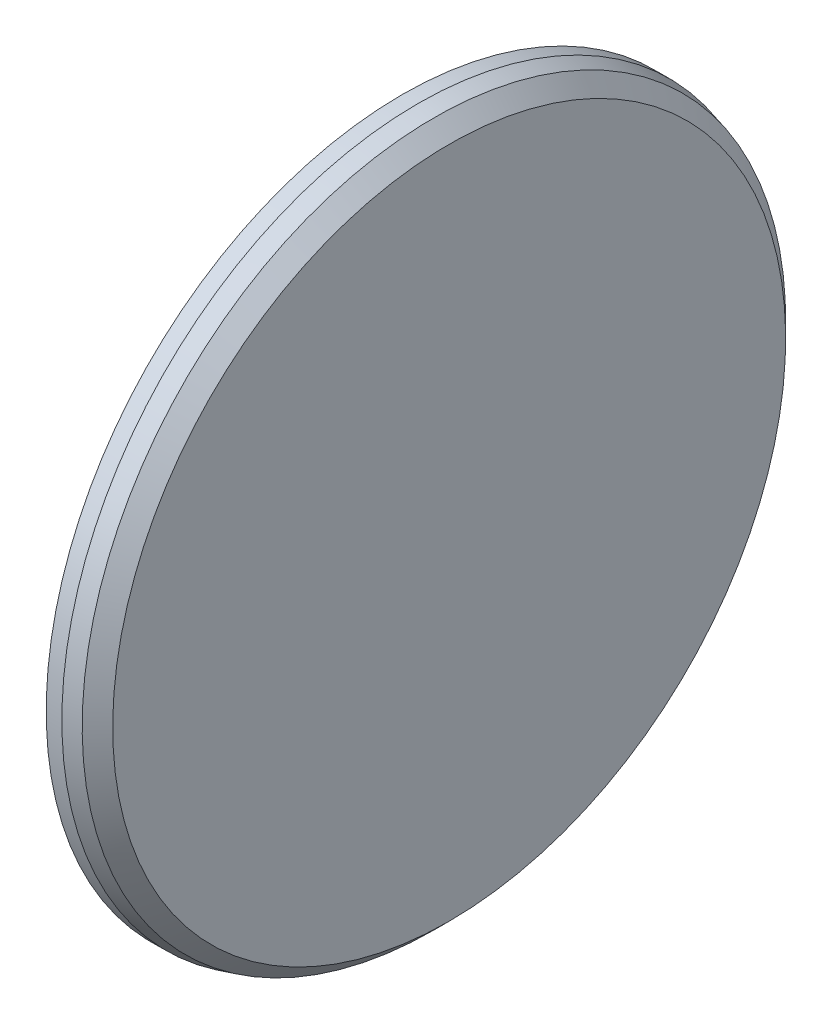
ISO-10303-21;
HEADER;
FILE_DESCRIPTION(('STEP AP214'),'2;1');
FILE_NAME('part.step','',(''),(''),'','','');
FILE_SCHEMA(('AUTOMOTIVE_DESIGN { 1 0 10303 214 1 1 1 1 }'));
ENDSEC;
DATA;
#1=APPLICATION_CONTEXT('core data for automotive mechanical design processes');
#2=APPLICATION_PROTOCOL_DEFINITION('international standard','automotive_design',2000,#1);
#3=PRODUCT_CONTEXT('',#1,'mechanical');
#4=PRODUCT('Part','Part','',(#3));
#5=PRODUCT_RELATED_PRODUCT_CATEGORY('part','',(#4));
#6=PRODUCT_DEFINITION_FORMATION('','',#4);
#7=PRODUCT_DEFINITION_CONTEXT('part definition',#1,'design');
#8=PRODUCT_DEFINITION('design','',#6,#7);
#9=PRODUCT_DEFINITION_SHAPE('','',#8);
#10=(LENGTH_UNIT() NAMED_UNIT(*) SI_UNIT(.MILLI.,.METRE.));
#11=(NAMED_UNIT(*) PLANE_ANGLE_UNIT() SI_UNIT($,.RADIAN.));
#12=(NAMED_UNIT(*) SI_UNIT($,.STERADIAN.) SOLID_ANGLE_UNIT());
#13=UNCERTAINTY_MEASURE_WITH_UNIT(LENGTH_MEASURE(1.E-05),#10,'distance_accuracy_value','');
#14=(GEOMETRIC_REPRESENTATION_CONTEXT(3) GLOBAL_UNCERTAINTY_ASSIGNED_CONTEXT((#13)) GLOBAL_UNIT_ASSIGNED_CONTEXT((#10,
#11,#12)) REPRESENTATION_CONTEXT('',''));
#15=CARTESIAN_POINT('',(0.,0.,0.));
#16=DIRECTION('',(0.,0.,1.));
#17=DIRECTION('',(1.,0.,0.));
#18=AXIS2_PLACEMENT_3D('',#15,#16,#17);
#19=CARTESIAN_POINT('',(40.,0.,0.));
#20=DIRECTION('',(-1.,0.,0.));
#21=DIRECTION('',(0.,-1.,0.));
#22=AXIS2_PLACEMENT_3D('',#19,#20,#21);
#23=PLANE('',#22);
#24=CARTESIAN_POINT('',(40.,0.,0.));
#25=DIRECTION('',(-1.,0.,0.));
#26=DIRECTION('',(0.,-1.,0.));
#27=AXIS2_PLACEMENT_3D('',#24,#25,#26);
#28=CIRCLE('',#27,430.);
#29=CARTESIAN_POINT('',(40.0000000000001,-430.,0.));
#30=VERTEX_POINT('',#29);
#31=EDGE_CURVE('E10',#30,#30,#28,.T.);
#32=ORIENTED_EDGE('',*,*,#31,.F.);
#33=EDGE_LOOP('',(#32));
#34=FACE_BOUND('',#33,.T.);
#35=ADVANCED_FACE('F43',(#34),#23,.F.);
#36=CARTESIAN_POINT('',(20.490381056767,0.,0.));
#37=DIRECTION('',(-1.,0.,0.));
#38=DIRECTION('',(0.,-1.,0.));
#39=AXIS2_PLACEMENT_3D('',#36,#37,#38);
#40=CONICAL_SURFACE('',#39,449.509618943233,0.785398163397454);
#41=ORIENTED_EDGE('',*,*,#31,.T.);
#42=EDGE_LOOP('',(#41));
#43=FACE_BOUND('',#42,.T.);
#44=CARTESIAN_POINT('',(20.490381056767,0.,0.));
#45=DIRECTION('',(-1.,0.,0.));
#46=DIRECTION('',(0.,-1.,0.));
#47=AXIS2_PLACEMENT_3D('',#44,#45,#46);
#48=CIRCLE('',#47,449.509618943233);
#49=CARTESIAN_POINT('',(20.490381056767,-449.509618943233,0.));
#50=VERTEX_POINT('',#49);
#51=EDGE_CURVE('E49',#50,#50,#48,.T.);
#52=ORIENTED_EDGE('',*,*,#51,.F.);
#53=EDGE_LOOP('',(#52));
#54=FACE_BOUND('',#53,.T.);
#55=ADVANCED_FACE('F91',(#43,#54),#40,.T.);
#56=CARTESIAN_POINT('',(0.,0.,0.));
#57=DIRECTION('',(-1.,0.,0.));
#58=DIRECTION('',(0.,-1.,0.));
#59=AXIS2_PLACEMENT_3D('',#56,#57,#58);
#60=CONICAL_SURFACE('',#59,455.,0.261799387799151);
#61=ORIENTED_EDGE('',*,*,#51,.T.);
#62=EDGE_LOOP('',(#61));
#63=FACE_BOUND('',#62,.T.);
#64=CARTESIAN_POINT('',(0.,0.,0.));
#65=DIRECTION('',(-1.,0.,0.));
#66=DIRECTION('',(0.,-1.,0.));
#67=AXIS2_PLACEMENT_3D('',#64,#65,#66);
#68=CIRCLE('',#67,455.);
#69=CARTESIAN_POINT('',(1.66848870888694E-13,-455.,0.));
#70=VERTEX_POINT('',#69);
#71=EDGE_CURVE('E53',#70,#70,#68,.T.);
#72=ORIENTED_EDGE('',*,*,#71,.F.);
#73=EDGE_LOOP('',(#72));
#74=FACE_BOUND('',#73,.T.);
#75=ADVANCED_FACE('F96',(#63,#74),#60,.T.);
#76=CARTESIAN_POINT('',(-40.,0.,0.));
#77=DIRECTION('',(-1.,0.,0.));
#78=DIRECTION('',(0.,-1.,0.));
#79=AXIS2_PLACEMENT_3D('',#76,#77,#78);
#80=CYLINDRICAL_SURFACE('',#79,455.);
#81=ORIENTED_EDGE('',*,*,#71,.T.);
#82=EDGE_LOOP('',(#81));
#83=FACE_BOUND('',#82,.T.);
#84=CARTESIAN_POINT('',(-19.9999999999999,0.,0.));
#85=DIRECTION('',(-1.,0.,0.));
#86=DIRECTION('',(0.,-1.,0.));
#87=AXIS2_PLACEMENT_3D('',#84,#85,#86);
#88=CIRCLE('',#87,455.);
#89=CARTESIAN_POINT('',(-19.9999999999998,-455.,0.));
#90=VERTEX_POINT('',#89);
#91=EDGE_CURVE('E57',#90,#90,#88,.T.);
#92=ORIENTED_EDGE('',*,*,#91,.F.);
#93=EDGE_LOOP('',(#92));
#94=FACE_BOUND('',#93,.T.);
#95=ADVANCED_FACE('F100',(#83,#94),#80,.T.);
#96=CARTESIAN_POINT('',(-19.9999999999999,0.,0.));
#97=DIRECTION('',(1.,0.,0.));
#98=DIRECTION('',(0.,1.,0.));
#99=AXIS2_PLACEMENT_3D('',#96,#97,#98);
#100=PLANE('',#99);
#101=CARTESIAN_POINT('',(-19.9999999999999,0.,0.));
#102=DIRECTION('',(-1.,0.,0.));
#103=DIRECTION('',(0.,-1.,0.));
#104=AXIS2_PLACEMENT_3D('',#101,#102,#103);
#105=CIRCLE('',#104,410.);
#106=CARTESIAN_POINT('',(-19.9999999999998,-410.,0.));
#107=VERTEX_POINT('',#106);
#108=EDGE_CURVE('E62',#107,#107,#105,.T.);
#109=ORIENTED_EDGE('',*,*,#108,.F.);
#110=EDGE_LOOP('',(#109));
#111=FACE_BOUND('',#110,.T.);
#112=ORIENTED_EDGE('',*,*,#91,.T.);
#113=EDGE_LOOP('',(#112));
#114=FACE_BOUND('',#113,.T.);
#115=ADVANCED_FACE('F106',(#111,#114),#100,.F.);
#116=CARTESIAN_POINT('',(-40.,0.,0.));
#117=DIRECTION('',(-1.,0.,0.));
#118=DIRECTION('',(0.,-1.,0.));
#119=AXIS2_PLACEMENT_3D('',#116,#117,#118);
#120=CYLINDRICAL_SURFACE('',#119,410.);
#121=ORIENTED_EDGE('',*,*,#108,.T.);
#122=EDGE_LOOP('',(#121));
#123=FACE_BOUND('',#122,.T.);
#124=CARTESIAN_POINT('',(10.0000000000001,0.,0.));
#125=DIRECTION('',(-1.,0.,0.));
#126=DIRECTION('',(0.,-1.,0.));
#127=AXIS2_PLACEMENT_3D('',#124,#125,#126);
#128=CIRCLE('',#127,410.);
#129=CARTESIAN_POINT('',(10.0000000000002,-410.,0.));
#130=VERTEX_POINT('',#129);
#131=EDGE_CURVE('E65',#130,#130,#128,.T.);
#132=ORIENTED_EDGE('',*,*,#131,.F.);
#133=EDGE_LOOP('',(#132));
#134=FACE_BOUND('',#133,.T.);
#135=ADVANCED_FACE('F87',(#123,#134),#120,.F.);
#136=CARTESIAN_POINT('',(10.,0.,0.));
#137=DIRECTION('',(-1.,0.,0.));
#138=DIRECTION('',(0.,-1.,0.));
#139=AXIS2_PLACEMENT_3D('',#136,#137,#138);
#140=PLANE('',#139);
#141=ORIENTED_EDGE('',*,*,#131,.T.);
#142=EDGE_LOOP('',(#141));
#143=FACE_BOUND('',#142,.T.);
#144=CARTESIAN_POINT('',(10.,0.,0.));
#145=DIRECTION('',(-1.,0.,0.));
#146=DIRECTION('',(0.,-1.,0.));
#147=AXIS2_PLACEMENT_3D('',#144,#145,#146);
#148=CIRCLE('',#147,100.);
#149=CARTESIAN_POINT('',(10.,-100.,0.));
#150=VERTEX_POINT('',#149);
#151=EDGE_CURVE('E68',#150,#150,#148,.T.);
#152=ORIENTED_EDGE('',*,*,#151,.F.);
#153=EDGE_LOOP('',(#152));
#154=FACE_BOUND('',#153,.T.);
#155=ADVANCED_FACE('F79',(#143,#154),#140,.T.);
#156=CARTESIAN_POINT('',(-40.,0.,0.));
#157=DIRECTION('',(-1.,0.,0.));
#158=DIRECTION('',(0.,-1.,0.));
#159=AXIS2_PLACEMENT_3D('',#156,#157,#158);
#160=CYLINDRICAL_SURFACE('',#159,100.);
#161=ORIENTED_EDGE('',*,*,#151,.T.);
#162=EDGE_LOOP('',(#161));
#163=FACE_BOUND('',#162,.T.);
#164=CARTESIAN_POINT('',(-40.,0.,0.));
#165=DIRECTION('',(-1.,0.,0.));
#166=DIRECTION('',(0.,-1.,0.));
#167=AXIS2_PLACEMENT_3D('',#164,#165,#166);
#168=CIRCLE('',#167,100.);
#169=CARTESIAN_POINT('',(-40.,-100.,0.));
#170=VERTEX_POINT('',#169);
#171=EDGE_CURVE('E71',#170,#170,#168,.T.);
#172=ORIENTED_EDGE('',*,*,#171,.F.);
#173=EDGE_LOOP('',(#172));
#174=FACE_BOUND('',#173,.T.);
#175=ADVANCED_FACE('F77',(#163,#174),#160,.T.);
#176=CARTESIAN_POINT('',(-40.,0.,0.));
#177=DIRECTION('',(-1.,0.,0.));
#178=DIRECTION('',(0.,-1.,0.));
#179=AXIS2_PLACEMENT_3D('',#176,#177,#178);
#180=PLANE('',#179);
#181=ORIENTED_EDGE('',*,*,#171,.T.);
#182=EDGE_LOOP('',(#181));
#183=FACE_BOUND('',#182,.T.);
#184=ADVANCED_FACE('F75',(#183),#180,.T.);
#185=CLOSED_SHELL('',(#35,#55,#75,#95,#115,#135,#155,#175,#184));
#186=MANIFOLD_SOLID_BREP('B2',#185);
#187=ADVANCED_BREP_SHAPE_REPRESENTATION('',(#18,#186),#14);
#188=SHAPE_DEFINITION_REPRESENTATION(#9,#187);
ENDSEC;
END-ISO-10303-21;
